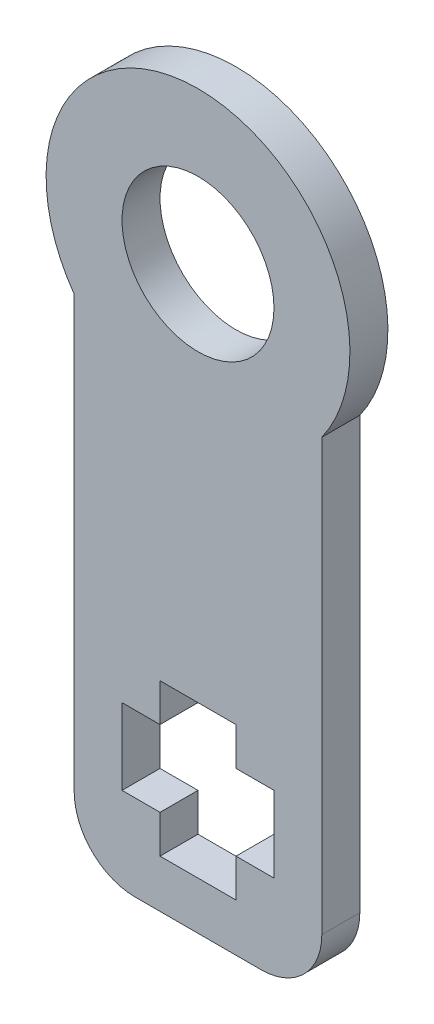
ISO-10303-21;
HEADER;
FILE_DESCRIPTION(('STEP AP214'),'2;1');
FILE_NAME('part.step','',(''),(''),'','','');
FILE_SCHEMA(('AUTOMOTIVE_DESIGN { 1 0 10303 214 1 1 1 1 }'));
ENDSEC;
DATA;
#1=APPLICATION_CONTEXT('core data for automotive mechanical design processes');
#2=APPLICATION_PROTOCOL_DEFINITION('international standard','automotive_design',2000,#1);
#3=PRODUCT_CONTEXT('',#1,'mechanical');
#4=PRODUCT('Part','Part','',(#3));
#5=PRODUCT_RELATED_PRODUCT_CATEGORY('part','',(#4));
#6=PRODUCT_DEFINITION_FORMATION('','',#4);
#7=PRODUCT_DEFINITION_CONTEXT('part definition',#1,'design');
#8=PRODUCT_DEFINITION('design','',#6,#7);
#9=PRODUCT_DEFINITION_SHAPE('','',#8);
#10=(LENGTH_UNIT() NAMED_UNIT(*) SI_UNIT(.MILLI.,.METRE.));
#11=(NAMED_UNIT(*) PLANE_ANGLE_UNIT() SI_UNIT($,.RADIAN.));
#12=(NAMED_UNIT(*) SI_UNIT($,.STERADIAN.) SOLID_ANGLE_UNIT());
#13=UNCERTAINTY_MEASURE_WITH_UNIT(LENGTH_MEASURE(1.E-05),#10,'distance_accuracy_value','');
#14=(GEOMETRIC_REPRESENTATION_CONTEXT(3) GLOBAL_UNCERTAINTY_ASSIGNED_CONTEXT((#13)) GLOBAL_UNIT_ASSIGNED_CONTEXT((#10,
#11,#12)) REPRESENTATION_CONTEXT('',''));
#15=CARTESIAN_POINT('',(0.,0.,0.));
#16=DIRECTION('',(0.,0.,1.));
#17=DIRECTION('',(1.,0.,0.));
#18=AXIS2_PLACEMENT_3D('',#15,#16,#17);
#19=CARTESIAN_POINT('',(0.,19.05,1.5875));
#20=DIRECTION('',(0.,0.,1.));
#21=DIRECTION('',(1.,0.,0.));
#22=AXIS2_PLACEMENT_3D('',#19,#20,#21);
#23=PLANE('',#22);
#24=CARTESIAN_POINT('',(0.,19.05,1.5875));
#25=DIRECTION('',(0.,0.,1.));
#26=DIRECTION('',(1.,0.,0.));
#27=AXIS2_PLACEMENT_3D('',#24,#25,#26);
#28=CIRCLE('',#27,3.175);
#29=CARTESIAN_POINT('',(3.175,19.05,1.5875));
#30=VERTEX_POINT('',#29);
#31=EDGE_CURVE('E514',#30,#30,#28,.T.);
#32=ORIENTED_EDGE('',*,*,#31,.F.);
#33=EDGE_LOOP('',(#32));
#34=FACE_BOUND('',#33,.T.);
#35=DIRECTION('',(1.,0.,0.));
#36=VECTOR('',#35,1.);
#37=CARTESIAN_POINT('',(-5.175,-5.175,1.5875));
#38=LINE('',#37,#36);
#39=CARTESIAN_POINT('',(-2.635,-5.175,1.5875));
#40=VERTEX_POINT('',#39);
#41=CARTESIAN_POINT('',(2.635,-5.175,1.5875));
#42=VERTEX_POINT('',#41);
#43=EDGE_CURVE('E266',#40,#42,#38,.T.);
#44=ORIENTED_EDGE('',*,*,#43,.T.);
#45=CARTESIAN_POINT('',(2.635,-2.635,1.5875));
#46=DIRECTION('',(0.,0.,1.));
#47=DIRECTION('',(1.,0.,0.));
#48=AXIS2_PLACEMENT_3D('',#45,#46,#47);
#49=CIRCLE('',#48,2.54);
#50=CARTESIAN_POINT('',(5.175,-2.635,1.5875));
#51=VERTEX_POINT('',#50);
#52=EDGE_CURVE('E41',#42,#51,#49,.T.);
#53=ORIENTED_EDGE('',*,*,#52,.T.);
#54=DIRECTION('',(0.,1.,0.));
#55=VECTOR('',#54,1.);
#56=CARTESIAN_POINT('',(5.175,-5.175,1.5875));
#57=LINE('',#56,#55);
#58=CARTESIAN_POINT('',(5.175,15.3700713322131,1.5875));
#59=VERTEX_POINT('',#58);
#60=EDGE_CURVE('E268',#51,#59,#57,.T.);
#61=ORIENTED_EDGE('',*,*,#60,.T.);
#62=CARTESIAN_POINT('',(0.,19.05,1.5875));
#63=DIRECTION('',(0.,0.,1.));
#64=DIRECTION('',(1.,0.,0.));
#65=AXIS2_PLACEMENT_3D('',#62,#63,#64);
#66=CIRCLE('',#65,6.35);
#67=CARTESIAN_POINT('',(-5.175,15.3700713322131,1.5875));
#68=VERTEX_POINT('',#67);
#69=EDGE_CURVE('E260',#59,#68,#66,.T.);
#70=ORIENTED_EDGE('',*,*,#69,.T.);
#71=DIRECTION('',(0.,-1.,0.));
#72=VECTOR('',#71,1.);
#73=CARTESIAN_POINT('',(-5.175,15.3700713322131,1.5875));
#74=LINE('',#73,#72);
#75=CARTESIAN_POINT('',(-5.175,-2.635,1.5875));
#76=VERTEX_POINT('',#75);
#77=EDGE_CURVE('E263',#68,#76,#74,.T.);
#78=ORIENTED_EDGE('',*,*,#77,.T.);
#79=CARTESIAN_POINT('',(-2.635,-2.635,1.5875));
#80=DIRECTION('',(0.,0.,1.));
#81=DIRECTION('',(1.,0.,0.));
#82=AXIS2_PLACEMENT_3D('',#79,#80,#81);
#83=CIRCLE('',#82,2.54);
#84=EDGE_CURVE('E294',#76,#40,#83,.T.);
#85=ORIENTED_EDGE('',*,*,#84,.T.);
#86=EDGE_LOOP('',(#44,#53,#61,#70,#78,#85));
#87=FACE_BOUND('',#86,.T.);
#88=DIRECTION('',(1.,0.,0.));
#89=VECTOR('',#88,1.);
#90=CARTESIAN_POINT('',(-1.5875,-3.175,1.5875));
#91=LINE('',#90,#89);
#92=CARTESIAN_POINT('',(-1.5875,-3.175,1.5875));
#93=VERTEX_POINT('',#92);
#94=CARTESIAN_POINT('',(1.5875,-3.175,1.5875));
#95=VERTEX_POINT('',#94);
#96=EDGE_CURVE('E170',#93,#95,#91,.T.);
#97=ORIENTED_EDGE('',*,*,#96,.F.);
#98=DIRECTION('',(0.,-1.,0.));
#99=VECTOR('',#98,1.);
#100=CARTESIAN_POINT('',(-1.5875,-1.5875,1.5875));
#101=LINE('',#100,#99);
#102=CARTESIAN_POINT('',(-1.5875,-1.5875,1.5875));
#103=VERTEX_POINT('',#102);
#104=EDGE_CURVE('E160',#103,#93,#101,.T.);
#105=ORIENTED_EDGE('',*,*,#104,.F.);
#106=DIRECTION('',(1.,0.,0.));
#107=VECTOR('',#106,1.);
#108=CARTESIAN_POINT('',(-3.175,-1.5875,1.5875));
#109=LINE('',#108,#107);
#110=CARTESIAN_POINT('',(-3.175,-1.5875,1.5875));
#111=VERTEX_POINT('',#110);
#112=EDGE_CURVE('E205',#111,#103,#109,.T.);
#113=ORIENTED_EDGE('',*,*,#112,.F.);
#114=DIRECTION('',(0.,-1.,0.));
#115=VECTOR('',#114,1.);
#116=CARTESIAN_POINT('',(-3.175,-1.5875,1.5875));
#117=LINE('',#116,#115);
#118=CARTESIAN_POINT('',(-3.175,1.5875,1.5875));
#119=VERTEX_POINT('',#118);
#120=EDGE_CURVE('E202',#119,#111,#117,.T.);
#121=ORIENTED_EDGE('',*,*,#120,.F.);
#122=DIRECTION('',(-1.,0.,0.));
#123=VECTOR('',#122,1.);
#124=CARTESIAN_POINT('',(-3.175,1.5875,1.5875));
#125=LINE('',#124,#123);
#126=CARTESIAN_POINT('',(-1.5875,1.5875,1.5875));
#127=VERTEX_POINT('',#126);
#128=EDGE_CURVE('E200',#127,#119,#125,.T.);
#129=ORIENTED_EDGE('',*,*,#128,.F.);
#130=DIRECTION('',(0.,-1.,0.));
#131=VECTOR('',#130,1.);
#132=CARTESIAN_POINT('',(-1.5875,1.5875,1.5875));
#133=LINE('',#132,#131);
#134=CARTESIAN_POINT('',(-1.5875,3.175,1.5875));
#135=VERTEX_POINT('',#134);
#136=EDGE_CURVE('E198',#135,#127,#133,.T.);
#137=ORIENTED_EDGE('',*,*,#136,.F.);
#138=DIRECTION('',(-1.,0.,0.));
#139=VECTOR('',#138,1.);
#140=CARTESIAN_POINT('',(-1.5875,3.175,1.5875));
#141=LINE('',#140,#139);
#142=CARTESIAN_POINT('',(1.5875,3.175,1.5875));
#143=VERTEX_POINT('',#142);
#144=EDGE_CURVE('E196',#143,#135,#141,.T.);
#145=ORIENTED_EDGE('',*,*,#144,.F.);
#146=DIRECTION('',(0.,1.,0.));
#147=VECTOR('',#146,1.);
#148=CARTESIAN_POINT('',(1.5875,1.5875,1.5875));
#149=LINE('',#148,#147);
#150=CARTESIAN_POINT('',(1.5875,1.5875,1.5875));
#151=VERTEX_POINT('',#150);
#152=EDGE_CURVE('E194',#151,#143,#149,.T.);
#153=ORIENTED_EDGE('',*,*,#152,.F.);
#154=DIRECTION('',(-1.,0.,0.));
#155=VECTOR('',#154,1.);
#156=CARTESIAN_POINT('',(3.175,1.5875,1.5875));
#157=LINE('',#156,#155);
#158=CARTESIAN_POINT('',(3.175,1.5875,1.5875));
#159=VERTEX_POINT('',#158);
#160=EDGE_CURVE('E192',#159,#151,#157,.T.);
#161=ORIENTED_EDGE('',*,*,#160,.F.);
#162=DIRECTION('',(0.,1.,0.));
#163=VECTOR('',#162,1.);
#164=CARTESIAN_POINT('',(3.175,-1.5875,1.5875));
#165=LINE('',#164,#163);
#166=CARTESIAN_POINT('',(3.175,-1.5875,1.5875));
#167=VERTEX_POINT('',#166);
#168=EDGE_CURVE('E190',#167,#159,#165,.T.);
#169=ORIENTED_EDGE('',*,*,#168,.F.);
#170=DIRECTION('',(1.,0.,0.));
#171=VECTOR('',#170,1.);
#172=CARTESIAN_POINT('',(3.175,-1.5875,1.5875));
#173=LINE('',#172,#171);
#174=CARTESIAN_POINT('',(1.5875,-1.5875,1.5875));
#175=VERTEX_POINT('',#174);
#176=EDGE_CURVE('E185',#175,#167,#173,.T.);
#177=ORIENTED_EDGE('',*,*,#176,.F.);
#178=DIRECTION('',(0.,1.,0.));
#179=VECTOR('',#178,1.);
#180=CARTESIAN_POINT('',(1.5875,-1.5875,1.5875));
#181=LINE('',#180,#179);
#182=EDGE_CURVE('E183',#95,#175,#181,.T.);
#183=ORIENTED_EDGE('',*,*,#182,.F.);
#184=EDGE_LOOP('',(#97,#105,#113,#121,#129,#137,#145,#153,#161,#169,#177,#183));
#185=FACE_BOUND('',#184,.T.);
#186=ADVANCED_FACE('F33',(#34,#87,#185),#23,.T.);
#187=CARTESIAN_POINT('',(0.,19.05,0.));
#188=DIRECTION('',(0.,0.,1.));
#189=DIRECTION('',(1.,0.,0.));
#190=AXIS2_PLACEMENT_3D('',#187,#188,#189);
#191=PLANE('',#190);
#192=CARTESIAN_POINT('',(0.,19.05,0.));
#193=DIRECTION('',(0.,0.,1.));
#194=DIRECTION('',(1.,0.,0.));
#195=AXIS2_PLACEMENT_3D('',#192,#193,#194);
#196=CIRCLE('',#195,3.175);
#197=CARTESIAN_POINT('',(3.175,19.05,0.));
#198=VERTEX_POINT('',#197);
#199=EDGE_CURVE('E209',#198,#198,#196,.T.);
#200=ORIENTED_EDGE('',*,*,#199,.T.);
#201=EDGE_LOOP('',(#200));
#202=FACE_BOUND('',#201,.T.);
#203=DIRECTION('',(0.,1.,0.));
#204=VECTOR('',#203,1.);
#205=CARTESIAN_POINT('',(5.175,-5.175,0.));
#206=LINE('',#205,#204);
#207=CARTESIAN_POINT('',(5.175,-2.635,0.));
#208=VERTEX_POINT('',#207);
#209=CARTESIAN_POINT('',(5.175,15.3700713322131,0.));
#210=VERTEX_POINT('',#209);
#211=EDGE_CURVE('E264',#208,#210,#206,.T.);
#212=ORIENTED_EDGE('',*,*,#211,.F.);
#213=CARTESIAN_POINT('',(2.635,-2.635,0.));
#214=DIRECTION('',(0.,0.,1.));
#215=DIRECTION('',(1.,0.,0.));
#216=AXIS2_PLACEMENT_3D('',#213,#214,#215);
#217=CIRCLE('',#216,2.54);
#218=CARTESIAN_POINT('',(2.635,-5.175,0.));
#219=VERTEX_POINT('',#218);
#220=EDGE_CURVE('E288',#208,#219,#217,.F.);
#221=ORIENTED_EDGE('',*,*,#220,.T.);
#222=DIRECTION('',(1.,0.,0.));
#223=VECTOR('',#222,1.);
#224=CARTESIAN_POINT('',(-5.175,-5.175,0.));
#225=LINE('',#224,#223);
#226=CARTESIAN_POINT('',(-2.635,-5.175,0.));
#227=VERTEX_POINT('',#226);
#228=EDGE_CURVE('E275',#227,#219,#225,.T.);
#229=ORIENTED_EDGE('',*,*,#228,.F.);
#230=CARTESIAN_POINT('',(-2.635,-2.635,0.));
#231=DIRECTION('',(0.,0.,1.));
#232=DIRECTION('',(1.,0.,0.));
#233=AXIS2_PLACEMENT_3D('',#230,#231,#232);
#234=CIRCLE('',#233,2.54);
#235=CARTESIAN_POINT('',(-5.175,-2.635,0.));
#236=VERTEX_POINT('',#235);
#237=EDGE_CURVE('E286',#227,#236,#234,.F.);
#238=ORIENTED_EDGE('',*,*,#237,.T.);
#239=DIRECTION('',(0.,-1.,0.));
#240=VECTOR('',#239,1.);
#241=CARTESIAN_POINT('',(-5.175,15.3700713322131,0.));
#242=LINE('',#241,#240);
#243=CARTESIAN_POINT('',(-5.175,15.3700713322131,0.));
#244=VERTEX_POINT('',#243);
#245=EDGE_CURVE('E273',#244,#236,#242,.T.);
#246=ORIENTED_EDGE('',*,*,#245,.F.);
#247=CARTESIAN_POINT('',(0.,19.05,0.));
#248=DIRECTION('',(0.,0.,1.));
#249=DIRECTION('',(1.,0.,0.));
#250=AXIS2_PLACEMENT_3D('',#247,#248,#249);
#251=CIRCLE('',#250,6.35);
#252=EDGE_CURVE('E178',#210,#244,#251,.T.);
#253=ORIENTED_EDGE('',*,*,#252,.F.);
#254=EDGE_LOOP('',(#212,#221,#229,#238,#246,#253));
#255=FACE_BOUND('',#254,.T.);
#256=DIRECTION('',(0.,-1.,0.));
#257=VECTOR('',#256,1.);
#258=CARTESIAN_POINT('',(-1.5875,-1.5875,0.));
#259=LINE('',#258,#257);
#260=CARTESIAN_POINT('',(-1.5875,-1.5875,0.));
#261=VERTEX_POINT('',#260);
#262=CARTESIAN_POINT('',(-1.5875,-3.175,0.));
#263=VERTEX_POINT('',#262);
#264=EDGE_CURVE('E207',#261,#263,#259,.T.);
#265=ORIENTED_EDGE('',*,*,#264,.T.);
#266=DIRECTION('',(1.,0.,0.));
#267=VECTOR('',#266,1.);
#268=CARTESIAN_POINT('',(-1.5875,-3.175,0.));
#269=LINE('',#268,#267);
#270=CARTESIAN_POINT('',(1.5875,-3.175,0.));
#271=VERTEX_POINT('',#270);
#272=EDGE_CURVE('E177',#263,#271,#269,.T.);
#273=ORIENTED_EDGE('',*,*,#272,.T.);
#274=DIRECTION('',(0.,1.,0.));
#275=VECTOR('',#274,1.);
#276=CARTESIAN_POINT('',(1.5875,-1.5875,0.));
#277=LINE('',#276,#275);
#278=CARTESIAN_POINT('',(1.5875,-1.5875,0.));
#279=VERTEX_POINT('',#278);
#280=EDGE_CURVE('E211',#271,#279,#277,.T.);
#281=ORIENTED_EDGE('',*,*,#280,.T.);
#282=DIRECTION('',(1.,0.,0.));
#283=VECTOR('',#282,1.);
#284=CARTESIAN_POINT('',(3.175,-1.5875,0.));
#285=LINE('',#284,#283);
#286=CARTESIAN_POINT('',(3.175,-1.5875,0.));
#287=VERTEX_POINT('',#286);
#288=EDGE_CURVE('E214',#279,#287,#285,.T.);
#289=ORIENTED_EDGE('',*,*,#288,.T.);
#290=DIRECTION('',(0.,1.,0.));
#291=VECTOR('',#290,1.);
#292=CARTESIAN_POINT('',(3.175,-1.5875,0.));
#293=LINE('',#292,#291);
#294=CARTESIAN_POINT('',(3.175,1.5875,0.));
#295=VERTEX_POINT('',#294);
#296=EDGE_CURVE('E217',#287,#295,#293,.T.);
#297=ORIENTED_EDGE('',*,*,#296,.T.);
#298=DIRECTION('',(-1.,0.,0.));
#299=VECTOR('',#298,1.);
#300=CARTESIAN_POINT('',(3.175,1.5875,0.));
#301=LINE('',#300,#299);
#302=CARTESIAN_POINT('',(1.5875,1.5875,0.));
#303=VERTEX_POINT('',#302);
#304=EDGE_CURVE('E220',#295,#303,#301,.T.);
#305=ORIENTED_EDGE('',*,*,#304,.T.);
#306=DIRECTION('',(0.,1.,0.));
#307=VECTOR('',#306,1.);
#308=CARTESIAN_POINT('',(1.5875,1.5875,0.));
#309=LINE('',#308,#307);
#310=CARTESIAN_POINT('',(1.5875,3.175,0.));
#311=VERTEX_POINT('',#310);
#312=EDGE_CURVE('E223',#303,#311,#309,.T.);
#313=ORIENTED_EDGE('',*,*,#312,.T.);
#314=DIRECTION('',(-1.,0.,0.));
#315=VECTOR('',#314,1.);
#316=CARTESIAN_POINT('',(-1.5875,3.175,0.));
#317=LINE('',#316,#315);
#318=CARTESIAN_POINT('',(-1.5875,3.175,0.));
#319=VERTEX_POINT('',#318);
#320=EDGE_CURVE('E226',#311,#319,#317,.T.);
#321=ORIENTED_EDGE('',*,*,#320,.T.);
#322=DIRECTION('',(0.,-1.,0.));
#323=VECTOR('',#322,1.);
#324=CARTESIAN_POINT('',(-1.5875,1.5875,0.));
#325=LINE('',#324,#323);
#326=CARTESIAN_POINT('',(-1.5875,1.5875,0.));
#327=VERTEX_POINT('',#326);
#328=EDGE_CURVE('E229',#319,#327,#325,.T.);
#329=ORIENTED_EDGE('',*,*,#328,.T.);
#330=DIRECTION('',(-1.,0.,0.));
#331=VECTOR('',#330,1.);
#332=CARTESIAN_POINT('',(-3.175,1.5875,0.));
#333=LINE('',#332,#331);
#334=CARTESIAN_POINT('',(-3.175,1.5875,0.));
#335=VERTEX_POINT('',#334);
#336=EDGE_CURVE('E232',#327,#335,#333,.T.);
#337=ORIENTED_EDGE('',*,*,#336,.T.);
#338=DIRECTION('',(0.,-1.,0.));
#339=VECTOR('',#338,1.);
#340=CARTESIAN_POINT('',(-3.175,-1.5875,0.));
#341=LINE('',#340,#339);
#342=CARTESIAN_POINT('',(-3.175,-1.5875,0.));
#343=VERTEX_POINT('',#342);
#344=EDGE_CURVE('E235',#335,#343,#341,.T.);
#345=ORIENTED_EDGE('',*,*,#344,.T.);
#346=DIRECTION('',(1.,0.,0.));
#347=VECTOR('',#346,1.);
#348=CARTESIAN_POINT('',(-3.175,-1.5875,0.));
#349=LINE('',#348,#347);
#350=EDGE_CURVE('E171',#343,#261,#349,.T.);
#351=ORIENTED_EDGE('',*,*,#350,.T.);
#352=EDGE_LOOP('',(#265,#273,#281,#289,#297,#305,#313,#321,#329,#337,#345,#351));
#353=FACE_BOUND('',#352,.T.);
#354=ADVANCED_FACE('F308',(#202,#255,#353),#191,.F.);
#355=CARTESIAN_POINT('',(0.,19.05,1.5875));
#356=DIRECTION('',(0.,0.,-1.));
#357=DIRECTION('',(-1.,0.,0.));
#358=AXIS2_PLACEMENT_3D('',#355,#356,#357);
#359=CYLINDRICAL_SURFACE('',#358,6.35);
#360=ORIENTED_EDGE('',*,*,#252,.T.);
#361=DIRECTION('',(0.,0.,-1.));
#362=VECTOR('',#361,1.);
#363=CARTESIAN_POINT('',(-5.175,15.3700713322131,1.5875));
#364=LINE('',#363,#362);
#365=EDGE_CURVE('E280',#68,#244,#364,.T.);
#366=ORIENTED_EDGE('',*,*,#365,.F.);
#367=ORIENTED_EDGE('',*,*,#69,.F.);
#368=DIRECTION('',(0.,0.,-1.));
#369=VECTOR('',#368,1.);
#370=CARTESIAN_POINT('',(5.175,15.3700713322131,1.5875));
#371=LINE('',#370,#369);
#372=EDGE_CURVE('E270',#59,#210,#371,.T.);
#373=ORIENTED_EDGE('',*,*,#372,.T.);
#374=EDGE_LOOP('',(#360,#366,#367,#373));
#375=FACE_BOUND('',#374,.T.);
#376=ADVANCED_FACE('F318',(#375),#359,.T.);
#377=CARTESIAN_POINT('',(-5.175,15.3700713322131,1.5875));
#378=DIRECTION('',(1.,0.,0.));
#379=DIRECTION('',(0.,1.,0.));
#380=AXIS2_PLACEMENT_3D('',#377,#378,#379);
#381=PLANE('',#380);
#382=ORIENTED_EDGE('',*,*,#245,.T.);
#383=DIRECTION('',(0.,0.,-1.));
#384=VECTOR('',#383,1.);
#385=CARTESIAN_POINT('',(-5.175,-2.635,1.5875));
#386=LINE('',#385,#384);
#387=EDGE_CURVE('E11',#236,#76,#386,.F.);
#388=ORIENTED_EDGE('',*,*,#387,.T.);
#389=ORIENTED_EDGE('',*,*,#77,.F.);
#390=ORIENTED_EDGE('',*,*,#365,.T.);
#391=EDGE_LOOP('',(#382,#388,#389,#390));
#392=FACE_BOUND('',#391,.T.);
#393=ADVANCED_FACE('F315',(#392),#381,.F.);
#394=CARTESIAN_POINT('',(-5.175,-5.175,1.5875));
#395=DIRECTION('',(0.,1.,0.));
#396=DIRECTION('',(-1.,0.,0.));
#397=AXIS2_PLACEMENT_3D('',#394,#395,#396);
#398=PLANE('',#397);
#399=ORIENTED_EDGE('',*,*,#228,.T.);
#400=DIRECTION('',(0.,0.,-1.));
#401=VECTOR('',#400,1.);
#402=CARTESIAN_POINT('',(2.635,-5.175,1.5875));
#403=LINE('',#402,#401);
#404=EDGE_CURVE('E54',#219,#42,#403,.F.);
#405=ORIENTED_EDGE('',*,*,#404,.T.);
#406=ORIENTED_EDGE('',*,*,#43,.F.);
#407=DIRECTION('',(0.,0.,-1.));
#408=VECTOR('',#407,1.);
#409=CARTESIAN_POINT('',(-2.635,-5.175,1.5875));
#410=LINE('',#409,#408);
#411=EDGE_CURVE('E290',#40,#227,#410,.T.);
#412=ORIENTED_EDGE('',*,*,#411,.T.);
#413=EDGE_LOOP('',(#399,#405,#406,#412));
#414=FACE_BOUND('',#413,.T.);
#415=ADVANCED_FACE('F311',(#414),#398,.F.);
#416=CARTESIAN_POINT('',(5.175,-5.175,1.5875));
#417=DIRECTION('',(-1.,0.,0.));
#418=DIRECTION('',(0.,-1.,0.));
#419=AXIS2_PLACEMENT_3D('',#416,#417,#418);
#420=PLANE('',#419);
#421=ORIENTED_EDGE('',*,*,#60,.F.);
#422=DIRECTION('',(0.,0.,-1.));
#423=VECTOR('',#422,1.);
#424=CARTESIAN_POINT('',(5.175,-2.635,1.5875));
#425=LINE('',#424,#423);
#426=EDGE_CURVE('E283',#51,#208,#425,.T.);
#427=ORIENTED_EDGE('',*,*,#426,.T.);
#428=ORIENTED_EDGE('',*,*,#211,.T.);
#429=ORIENTED_EDGE('',*,*,#372,.F.);
#430=EDGE_LOOP('',(#421,#427,#428,#429));
#431=FACE_BOUND('',#430,.T.);
#432=ADVANCED_FACE('F302',(#431),#420,.F.);
#433=CARTESIAN_POINT('',(-1.5875,-1.5875,1.5875));
#434=DIRECTION('',(1.,0.,0.));
#435=DIRECTION('',(0.,1.,0.));
#436=AXIS2_PLACEMENT_3D('',#433,#434,#435);
#437=PLANE('',#436);
#438=ORIENTED_EDGE('',*,*,#264,.F.);
#439=DIRECTION('',(0.,0.,-1.));
#440=VECTOR('',#439,1.);
#441=CARTESIAN_POINT('',(-1.5875,-1.5875,1.5875));
#442=LINE('',#441,#440);
#443=EDGE_CURVE('E166',#103,#261,#442,.T.);
#444=ORIENTED_EDGE('',*,*,#443,.F.);
#445=ORIENTED_EDGE('',*,*,#104,.T.);
#446=DIRECTION('',(0.,0.,-1.));
#447=VECTOR('',#446,1.);
#448=CARTESIAN_POINT('',(-1.5875,-3.175,1.5875));
#449=LINE('',#448,#447);
#450=EDGE_CURVE('E163',#93,#263,#449,.T.);
#451=ORIENTED_EDGE('',*,*,#450,.T.);
#452=EDGE_LOOP('',(#438,#444,#445,#451));
#453=FACE_BOUND('',#452,.T.);
#454=ADVANCED_FACE('F162',(#453),#437,.T.);
#455=CARTESIAN_POINT('',(-1.5875,-3.175,1.5875));
#456=DIRECTION('',(0.,1.,0.));
#457=DIRECTION('',(0.,0.,1.));
#458=AXIS2_PLACEMENT_3D('',#455,#456,#457);
#459=PLANE('',#458);
#460=ORIENTED_EDGE('',*,*,#272,.F.);
#461=ORIENTED_EDGE('',*,*,#450,.F.);
#462=ORIENTED_EDGE('',*,*,#96,.T.);
#463=DIRECTION('',(0.,0.,-1.));
#464=VECTOR('',#463,1.);
#465=CARTESIAN_POINT('',(1.5875,-3.175,1.5875));
#466=LINE('',#465,#464);
#467=EDGE_CURVE('E179',#95,#271,#466,.T.);
#468=ORIENTED_EDGE('',*,*,#467,.T.);
#469=EDGE_LOOP('',(#460,#461,#462,#468));
#470=FACE_BOUND('',#469,.T.);
#471=ADVANCED_FACE('F174',(#470),#459,.T.);
#472=CARTESIAN_POINT('',(1.5875,-1.5875,1.5875));
#473=DIRECTION('',(-1.,0.,0.));
#474=DIRECTION('',(0.,-1.,0.));
#475=AXIS2_PLACEMENT_3D('',#472,#473,#474);
#476=PLANE('',#475);
#477=ORIENTED_EDGE('',*,*,#280,.F.);
#478=ORIENTED_EDGE('',*,*,#467,.F.);
#479=ORIENTED_EDGE('',*,*,#182,.T.);
#480=DIRECTION('',(0.,0.,-1.));
#481=VECTOR('',#480,1.);
#482=CARTESIAN_POINT('',(1.5875,-1.5875,1.5875));
#483=LINE('',#482,#481);
#484=EDGE_CURVE('E257',#175,#279,#483,.T.);
#485=ORIENTED_EDGE('',*,*,#484,.T.);
#486=EDGE_LOOP('',(#477,#478,#479,#485));
#487=FACE_BOUND('',#486,.T.);
#488=ADVANCED_FACE('F360',(#487),#476,.T.);
#489=CARTESIAN_POINT('',(3.175,-1.5875,1.5875));
#490=DIRECTION('',(0.,1.,0.));
#491=DIRECTION('',(-1.,0.,0.));
#492=AXIS2_PLACEMENT_3D('',#489,#490,#491);
#493=PLANE('',#492);
#494=ORIENTED_EDGE('',*,*,#288,.F.);
#495=ORIENTED_EDGE('',*,*,#484,.F.);
#496=ORIENTED_EDGE('',*,*,#176,.T.);
#497=DIRECTION('',(0.,0.,-1.));
#498=VECTOR('',#497,1.);
#499=CARTESIAN_POINT('',(3.175,-1.5875,1.5875));
#500=LINE('',#499,#498);
#501=EDGE_CURVE('E255',#167,#287,#500,.T.);
#502=ORIENTED_EDGE('',*,*,#501,.T.);
#503=EDGE_LOOP('',(#494,#495,#496,#502));
#504=FACE_BOUND('',#503,.T.);
#505=ADVANCED_FACE('F366',(#504),#493,.T.);
#506=CARTESIAN_POINT('',(3.175,-1.5875,1.5875));
#507=DIRECTION('',(-1.,0.,0.));
#508=DIRECTION('',(0.,-1.,0.));
#509=AXIS2_PLACEMENT_3D('',#506,#507,#508);
#510=PLANE('',#509);
#511=ORIENTED_EDGE('',*,*,#296,.F.);
#512=ORIENTED_EDGE('',*,*,#501,.F.);
#513=ORIENTED_EDGE('',*,*,#168,.T.);
#514=DIRECTION('',(0.,0.,-1.));
#515=VECTOR('',#514,1.);
#516=CARTESIAN_POINT('',(3.175,1.5875,1.5875));
#517=LINE('',#516,#515);
#518=EDGE_CURVE('E253',#159,#295,#517,.T.);
#519=ORIENTED_EDGE('',*,*,#518,.T.);
#520=EDGE_LOOP('',(#511,#512,#513,#519));
#521=FACE_BOUND('',#520,.T.);
#522=ADVANCED_FACE('F374',(#521),#510,.T.);
#523=CARTESIAN_POINT('',(3.175,1.5875,1.5875));
#524=DIRECTION('',(0.,-1.,0.));
#525=DIRECTION('',(1.,0.,0.));
#526=AXIS2_PLACEMENT_3D('',#523,#524,#525);
#527=PLANE('',#526);
#528=ORIENTED_EDGE('',*,*,#304,.F.);
#529=ORIENTED_EDGE('',*,*,#518,.F.);
#530=ORIENTED_EDGE('',*,*,#160,.T.);
#531=DIRECTION('',(0.,0.,-1.));
#532=VECTOR('',#531,1.);
#533=CARTESIAN_POINT('',(1.5875,1.5875,1.5875));
#534=LINE('',#533,#532);
#535=EDGE_CURVE('E251',#151,#303,#534,.T.);
#536=ORIENTED_EDGE('',*,*,#535,.T.);
#537=EDGE_LOOP('',(#528,#529,#530,#536));
#538=FACE_BOUND('',#537,.T.);
#539=ADVANCED_FACE('F382',(#538),#527,.T.);
#540=CARTESIAN_POINT('',(1.5875,1.5875,1.5875));
#541=DIRECTION('',(-1.,0.,0.));
#542=DIRECTION('',(0.,-1.,0.));
#543=AXIS2_PLACEMENT_3D('',#540,#541,#542);
#544=PLANE('',#543);
#545=ORIENTED_EDGE('',*,*,#312,.F.);
#546=ORIENTED_EDGE('',*,*,#535,.F.);
#547=ORIENTED_EDGE('',*,*,#152,.T.);
#548=DIRECTION('',(0.,0.,-1.));
#549=VECTOR('',#548,1.);
#550=CARTESIAN_POINT('',(1.5875,3.175,1.5875));
#551=LINE('',#550,#549);
#552=EDGE_CURVE('E249',#143,#311,#551,.T.);
#553=ORIENTED_EDGE('',*,*,#552,.T.);
#554=EDGE_LOOP('',(#545,#546,#547,#553));
#555=FACE_BOUND('',#554,.T.);
#556=ADVANCED_FACE('F390',(#555),#544,.T.);
#557=CARTESIAN_POINT('',(-1.5875,3.175,1.5875));
#558=DIRECTION('',(0.,-1.,0.));
#559=DIRECTION('',(0.,0.,-1.));
#560=AXIS2_PLACEMENT_3D('',#557,#558,#559);
#561=PLANE('',#560);
#562=ORIENTED_EDGE('',*,*,#320,.F.);
#563=ORIENTED_EDGE('',*,*,#552,.F.);
#564=ORIENTED_EDGE('',*,*,#144,.T.);
#565=DIRECTION('',(0.,0.,-1.));
#566=VECTOR('',#565,1.);
#567=CARTESIAN_POINT('',(-1.5875,3.175,1.5875));
#568=LINE('',#567,#566);
#569=EDGE_CURVE('E247',#135,#319,#568,.T.);
#570=ORIENTED_EDGE('',*,*,#569,.T.);
#571=EDGE_LOOP('',(#562,#563,#564,#570));
#572=FACE_BOUND('',#571,.T.);
#573=ADVANCED_FACE('F398',(#572),#561,.T.);
#574=CARTESIAN_POINT('',(-1.5875,1.5875,1.5875));
#575=DIRECTION('',(1.,0.,0.));
#576=DIRECTION('',(0.,0.,-1.));
#577=AXIS2_PLACEMENT_3D('',#574,#575,#576);
#578=PLANE('',#577);
#579=ORIENTED_EDGE('',*,*,#328,.F.);
#580=ORIENTED_EDGE('',*,*,#569,.F.);
#581=ORIENTED_EDGE('',*,*,#136,.T.);
#582=DIRECTION('',(0.,0.,-1.));
#583=VECTOR('',#582,1.);
#584=CARTESIAN_POINT('',(-1.5875,1.5875,1.5875));
#585=LINE('',#584,#583);
#586=EDGE_CURVE('E245',#127,#327,#585,.T.);
#587=ORIENTED_EDGE('',*,*,#586,.T.);
#588=EDGE_LOOP('',(#579,#580,#581,#587));
#589=FACE_BOUND('',#588,.T.);
#590=ADVANCED_FACE('F406',(#589),#578,.T.);
#591=CARTESIAN_POINT('',(-3.175,1.5875,1.5875));
#592=DIRECTION('',(0.,-1.,0.));
#593=DIRECTION('',(1.,0.,0.));
#594=AXIS2_PLACEMENT_3D('',#591,#592,#593);
#595=PLANE('',#594);
#596=ORIENTED_EDGE('',*,*,#336,.F.);
#597=ORIENTED_EDGE('',*,*,#586,.F.);
#598=ORIENTED_EDGE('',*,*,#128,.T.);
#599=DIRECTION('',(0.,0.,-1.));
#600=VECTOR('',#599,1.);
#601=CARTESIAN_POINT('',(-3.175,1.5875,1.5875));
#602=LINE('',#601,#600);
#603=EDGE_CURVE('E243',#119,#335,#602,.T.);
#604=ORIENTED_EDGE('',*,*,#603,.T.);
#605=EDGE_LOOP('',(#596,#597,#598,#604));
#606=FACE_BOUND('',#605,.T.);
#607=ADVANCED_FACE('F414',(#606),#595,.T.);
#608=CARTESIAN_POINT('',(-3.175,-1.5875,1.5875));
#609=DIRECTION('',(1.,0.,0.));
#610=DIRECTION('',(0.,1.,0.));
#611=AXIS2_PLACEMENT_3D('',#608,#609,#610);
#612=PLANE('',#611);
#613=ORIENTED_EDGE('',*,*,#344,.F.);
#614=ORIENTED_EDGE('',*,*,#603,.F.);
#615=ORIENTED_EDGE('',*,*,#120,.T.);
#616=DIRECTION('',(0.,0.,-1.));
#617=VECTOR('',#616,1.);
#618=CARTESIAN_POINT('',(-3.175,-1.5875,1.5875));
#619=LINE('',#618,#617);
#620=EDGE_CURVE('E241',#111,#343,#619,.T.);
#621=ORIENTED_EDGE('',*,*,#620,.T.);
#622=EDGE_LOOP('',(#613,#614,#615,#621));
#623=FACE_BOUND('',#622,.T.);
#624=ADVANCED_FACE('F422',(#623),#612,.T.);
#625=CARTESIAN_POINT('',(-3.175,-1.5875,1.5875));
#626=DIRECTION('',(0.,1.,0.));
#627=DIRECTION('',(-1.,0.,0.));
#628=AXIS2_PLACEMENT_3D('',#625,#626,#627);
#629=PLANE('',#628);
#630=ORIENTED_EDGE('',*,*,#350,.F.);
#631=ORIENTED_EDGE('',*,*,#620,.F.);
#632=ORIENTED_EDGE('',*,*,#112,.T.);
#633=ORIENTED_EDGE('',*,*,#443,.T.);
#634=EDGE_LOOP('',(#630,#631,#632,#633));
#635=FACE_BOUND('',#634,.T.);
#636=ADVANCED_FACE('F430',(#635),#629,.T.);
#637=CARTESIAN_POINT('',(2.635,-2.635,1.5875));
#638=DIRECTION('',(0.,0.,-1.));
#639=DIRECTION('',(-1.,0.,0.));
#640=AXIS2_PLACEMENT_3D('',#637,#638,#639);
#641=CYLINDRICAL_SURFACE('',#640,2.54);
#642=ORIENTED_EDGE('',*,*,#52,.F.);
#643=ORIENTED_EDGE('',*,*,#404,.F.);
#644=ORIENTED_EDGE('',*,*,#220,.F.);
#645=ORIENTED_EDGE('',*,*,#426,.F.);
#646=EDGE_LOOP('',(#642,#643,#644,#645));
#647=FACE_BOUND('',#646,.T.);
#648=ADVANCED_FACE('F305',(#647),#641,.T.);
#649=CARTESIAN_POINT('',(-2.635,-2.635,1.5875));
#650=DIRECTION('',(0.,0.,-1.));
#651=DIRECTION('',(-1.,0.,0.));
#652=AXIS2_PLACEMENT_3D('',#649,#650,#651);
#653=CYLINDRICAL_SURFACE('',#652,2.54);
#654=ORIENTED_EDGE('',*,*,#84,.F.);
#655=ORIENTED_EDGE('',*,*,#387,.F.);
#656=ORIENTED_EDGE('',*,*,#237,.F.);
#657=ORIENTED_EDGE('',*,*,#411,.F.);
#658=EDGE_LOOP('',(#654,#655,#656,#657));
#659=FACE_BOUND('',#658,.T.);
#660=ADVANCED_FACE('F35',(#659),#653,.T.);
#661=CARTESIAN_POINT('',(0.,19.05,0.));
#662=DIRECTION('',(0.,0.,1.));
#663=DIRECTION('',(1.,0.,0.));
#664=AXIS2_PLACEMENT_3D('',#661,#662,#663);
#665=CYLINDRICAL_SURFACE('',#664,3.175);
#666=ORIENTED_EDGE('',*,*,#199,.F.);
#667=EDGE_LOOP('',(#666));
#668=FACE_BOUND('',#667,.T.);
#669=ORIENTED_EDGE('',*,*,#31,.T.);
#670=EDGE_LOOP('',(#669));
#671=FACE_BOUND('',#670,.T.);
#672=ADVANCED_FACE('F449',(#668,#671),#665,.F.);
#673=CLOSED_SHELL('',(#186,#354,#376,#393,#415,#432,#454,#471,#488,#505,#522,#539,#556,#573,
#590,#607,#624,#636,#648,#660,#672));
#674=MANIFOLD_SOLID_BREP('B2',#673);
#675=ADVANCED_BREP_SHAPE_REPRESENTATION('',(#18,#674),#14);
#676=SHAPE_DEFINITION_REPRESENTATION(#9,#675);
ENDSEC;
END-ISO-10303-21;
